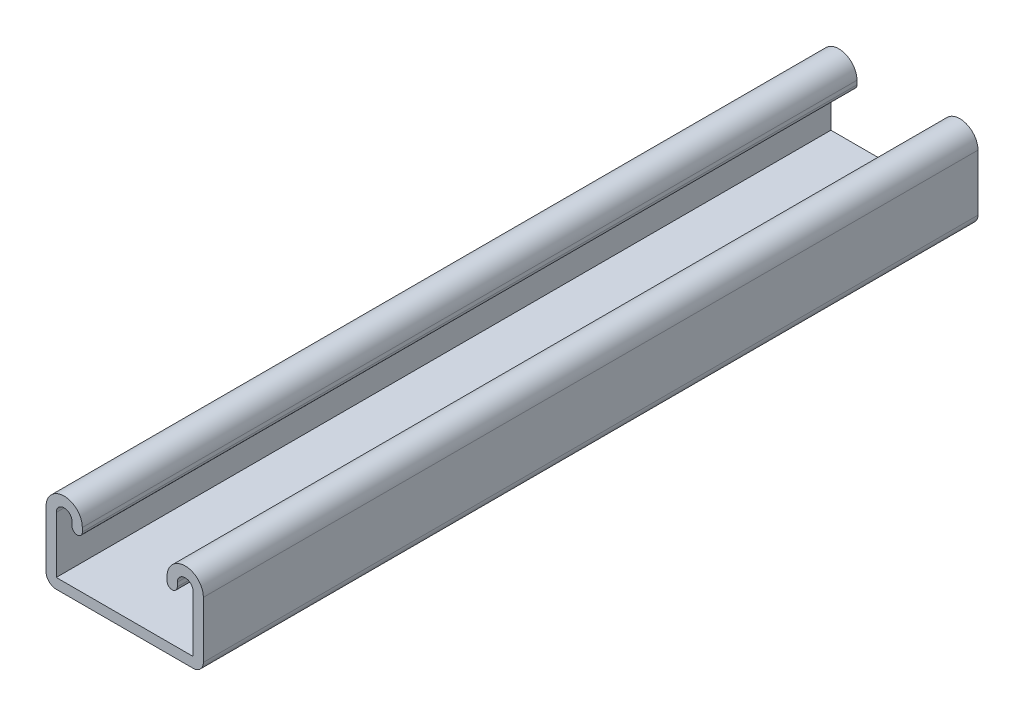
ISO-10303-21;
HEADER;
FILE_DESCRIPTION(('STEP AP214'),'2;1');
FILE_NAME('part.step','',(''),(''),'','','');
FILE_SCHEMA(('AUTOMOTIVE_DESIGN { 1 0 10303 214 1 1 1 1 }'));
ENDSEC;
DATA;
#1=APPLICATION_CONTEXT('core data for automotive mechanical design processes');
#2=APPLICATION_PROTOCOL_DEFINITION('international standard','automotive_design',2000,#1);
#3=PRODUCT_CONTEXT('',#1,'mechanical');
#4=PRODUCT('Part','Part','',(#3));
#5=PRODUCT_RELATED_PRODUCT_CATEGORY('part','',(#4));
#6=PRODUCT_DEFINITION_FORMATION('','',#4);
#7=PRODUCT_DEFINITION_CONTEXT('part definition',#1,'design');
#8=PRODUCT_DEFINITION('design','',#6,#7);
#9=PRODUCT_DEFINITION_SHAPE('','',#8);
#10=(LENGTH_UNIT() NAMED_UNIT(*) SI_UNIT(.MILLI.,.METRE.));
#11=(NAMED_UNIT(*) PLANE_ANGLE_UNIT() SI_UNIT($,.RADIAN.));
#12=(NAMED_UNIT(*) SI_UNIT($,.STERADIAN.) SOLID_ANGLE_UNIT());
#13=UNCERTAINTY_MEASURE_WITH_UNIT(LENGTH_MEASURE(1.E-05),#10,'distance_accuracy_value','');
#14=(GEOMETRIC_REPRESENTATION_CONTEXT(3) GLOBAL_UNCERTAINTY_ASSIGNED_CONTEXT((#13)) GLOBAL_UNIT_ASSIGNED_CONTEXT((#10,
#11,#12)) REPRESENTATION_CONTEXT('',''));
#15=CARTESIAN_POINT('',(0.,0.,0.));
#16=DIRECTION('',(0.,0.,1.));
#17=DIRECTION('',(1.,0.,0.));
#18=AXIS2_PLACEMENT_3D('',#15,#16,#17);
#19=CARTESIAN_POINT('',(-15.875,8.3693,203.2));
#20=DIRECTION('',(0.,0.,-1.));
#21=DIRECTION('',(-1.,0.,0.));
#22=AXIS2_PLACEMENT_3D('',#19,#20,#21);
#23=CYLINDRICAL_SURFACE('',#22,4.7625);
#24=CARTESIAN_POINT('',(-15.875,8.3693,0.));
#25=DIRECTION('',(0.,0.,1.));
#26=DIRECTION('',(-1.,0.,0.));
#27=AXIS2_PLACEMENT_3D('',#24,#25,#26);
#28=CIRCLE('',#27,4.7625);
#29=CARTESIAN_POINT('',(-11.1125,8.3693,0.));
#30=VERTEX_POINT('',#29);
#31=CARTESIAN_POINT('',(-20.6375,8.3693,0.));
#32=VERTEX_POINT('',#31);
#33=EDGE_CURVE('E253',#30,#32,#28,.T.);
#34=ORIENTED_EDGE('',*,*,#33,.T.);
#35=DIRECTION('',(0.,0.,-1.));
#36=VECTOR('',#35,1.);
#37=CARTESIAN_POINT('',(-20.6375,8.3693,203.2));
#38=LINE('',#37,#36);
#39=CARTESIAN_POINT('',(-20.6375,8.3693,203.2));
#40=VERTEX_POINT('',#39);
#41=EDGE_CURVE('E384',#40,#32,#38,.T.);
#42=ORIENTED_EDGE('',*,*,#41,.F.);
#43=CARTESIAN_POINT('',(-15.875,8.3693,203.2));
#44=DIRECTION('',(0.,0.,1.));
#45=DIRECTION('',(-1.,0.,0.));
#46=AXIS2_PLACEMENT_3D('',#43,#44,#45);
#47=CIRCLE('',#46,4.7625);
#48=CARTESIAN_POINT('',(-11.1125,8.3693,203.2));
#49=VERTEX_POINT('',#48);
#50=EDGE_CURVE('E260',#49,#40,#47,.T.);
#51=ORIENTED_EDGE('',*,*,#50,.F.);
#52=DIRECTION('',(0.,0.,-1.));
#53=VECTOR('',#52,1.);
#54=CARTESIAN_POINT('',(-11.1125,8.3693,203.2));
#55=LINE('',#54,#53);
#56=EDGE_CURVE('E298',#49,#30,#55,.T.);
#57=ORIENTED_EDGE('',*,*,#56,.T.);
#58=EDGE_LOOP('',(#34,#42,#51,#57));
#59=FACE_BOUND('',#58,.T.);
#60=ADVANCED_FACE('F32',(#59),#23,.T.);
#61=CARTESIAN_POINT('',(-20.6375,8.3693,203.2));
#62=DIRECTION('',(1.,0.,0.));
#63=DIRECTION('',(0.,1.,0.));
#64=AXIS2_PLACEMENT_3D('',#61,#62,#63);
#65=PLANE('',#64);
#66=DIRECTION('',(0.,-1.,0.));
#67=VECTOR('',#66,1.);
#68=CARTESIAN_POINT('',(-20.6375,8.3693,0.));
#69=LINE('',#68,#67);
#70=CARTESIAN_POINT('',(-20.6375,-6.4008,0.));
#71=VERTEX_POINT('',#70);
#72=EDGE_CURVE('E301',#32,#71,#69,.T.);
#73=ORIENTED_EDGE('',*,*,#72,.T.);
#74=DIRECTION('',(0.,0.,-1.));
#75=VECTOR('',#74,1.);
#76=CARTESIAN_POINT('',(-20.6375,-6.4008,203.2));
#77=LINE('',#76,#75);
#78=CARTESIAN_POINT('',(-20.6375,-6.4008,203.2));
#79=VERTEX_POINT('',#78);
#80=EDGE_CURVE('E381',#79,#71,#77,.T.);
#81=ORIENTED_EDGE('',*,*,#80,.F.);
#82=DIRECTION('',(0.,-1.,0.));
#83=VECTOR('',#82,1.);
#84=CARTESIAN_POINT('',(-20.6375,8.3693,203.2));
#85=LINE('',#84,#83);
#86=EDGE_CURVE('E263',#40,#79,#85,.T.);
#87=ORIENTED_EDGE('',*,*,#86,.F.);
#88=ORIENTED_EDGE('',*,*,#41,.T.);
#89=EDGE_LOOP('',(#73,#81,#87,#88));
#90=FACE_BOUND('',#89,.T.);
#91=ADVANCED_FACE('F425',(#90),#65,.F.);
#92=CARTESIAN_POINT('',(-17.9451,-6.4008,203.2));
#93=DIRECTION('',(0.,0.,-1.));
#94=DIRECTION('',(-1.,0.,0.));
#95=AXIS2_PLACEMENT_3D('',#92,#93,#94);
#96=CYLINDRICAL_SURFACE('',#95,2.6924);
#97=CARTESIAN_POINT('',(-17.9451,-6.4008,0.));
#98=DIRECTION('',(0.,0.,1.));
#99=DIRECTION('',(-1.,0.,0.));
#100=AXIS2_PLACEMENT_3D('',#97,#98,#99);
#101=CIRCLE('',#100,2.6924);
#102=CARTESIAN_POINT('',(-17.9451,-9.0932,0.));
#103=VERTEX_POINT('',#102);
#104=EDGE_CURVE('E303',#71,#103,#101,.T.);
#105=ORIENTED_EDGE('',*,*,#104,.T.);
#106=DIRECTION('',(0.,0.,-1.));
#107=VECTOR('',#106,1.);
#108=CARTESIAN_POINT('',(-17.9451,-9.0932,203.2));
#109=LINE('',#108,#107);
#110=CARTESIAN_POINT('',(-17.9451,-9.0932,203.2));
#111=VERTEX_POINT('',#110);
#112=EDGE_CURVE('E378',#111,#103,#109,.T.);
#113=ORIENTED_EDGE('',*,*,#112,.F.);
#114=CARTESIAN_POINT('',(-17.9451,-6.4008,203.2));
#115=DIRECTION('',(0.,0.,1.));
#116=DIRECTION('',(-1.,0.,0.));
#117=AXIS2_PLACEMENT_3D('',#114,#115,#116);
#118=CIRCLE('',#117,2.6924);
#119=EDGE_CURVE('E266',#79,#111,#118,.T.);
#120=ORIENTED_EDGE('',*,*,#119,.F.);
#121=ORIENTED_EDGE('',*,*,#80,.T.);
#122=EDGE_LOOP('',(#105,#113,#120,#121));
#123=FACE_BOUND('',#122,.T.);
#124=ADVANCED_FACE('F430',(#123),#96,.T.);
#125=CARTESIAN_POINT('',(-17.9451,-9.0932,203.2));
#126=DIRECTION('',(0.,1.,0.));
#127=DIRECTION('',(0.,0.,1.));
#128=AXIS2_PLACEMENT_3D('',#125,#126,#127);
#129=PLANE('',#128);
#130=DIRECTION('',(0.,0.,-1.));
#131=VECTOR('',#130,1.);
#132=CARTESIAN_POINT('',(-5.159375,-9.09319999999525,114.3));
#133=LINE('',#132,#131);
#134=CARTESIAN_POINT('',(-5.15937500000001,-9.0932,180.18125));
#135=VERTEX_POINT('',#134);
#136=CARTESIAN_POINT('',(-5.159375,-9.09319999999525,114.3));
#137=VERTEX_POINT('',#136);
#138=EDGE_CURVE('E206',#135,#137,#133,.T.);
#139=ORIENTED_EDGE('',*,*,#138,.F.);
#140=CARTESIAN_POINT('',(0.,-9.09319999999525,180.18125));
#141=DIRECTION('',(0.,-1.,0.));
#142=DIRECTION('',(0.,0.,-1.));
#143=AXIS2_PLACEMENT_3D('',#140,#141,#142);
#144=CIRCLE('',#143,5.159375);
#145=CARTESIAN_POINT('',(5.159375,-9.09319999999525,180.18125));
#146=VERTEX_POINT('',#145);
#147=EDGE_CURVE('E46',#146,#135,#144,.T.);
#148=ORIENTED_EDGE('',*,*,#147,.F.);
#149=DIRECTION('',(0.,0.,1.));
#150=VECTOR('',#149,1.);
#151=CARTESIAN_POINT('',(5.159375,-9.09319999999525,180.18125));
#152=LINE('',#151,#150);
#153=CARTESIAN_POINT('',(5.159375,-9.09319999999525,114.3));
#154=VERTEX_POINT('',#153);
#155=EDGE_CURVE('E222',#154,#146,#152,.T.);
#156=ORIENTED_EDGE('',*,*,#155,.F.);
#157=CARTESIAN_POINT('',(0.,-9.09319999999525,114.3));
#158=DIRECTION('',(0.,-1.,0.));
#159=DIRECTION('',(0.,0.,-1.));
#160=AXIS2_PLACEMENT_3D('',#157,#158,#159);
#161=CIRCLE('',#160,5.159375);
#162=EDGE_CURVE('E216',#137,#154,#161,.T.);
#163=ORIENTED_EDGE('',*,*,#162,.F.);
#164=EDGE_LOOP('',(#139,#148,#156,#163));
#165=FACE_BOUND('',#164,.T.);
#166=DIRECTION('',(0.,0.,-1.));
#167=VECTOR('',#166,1.);
#168=CARTESIAN_POINT('',(-5.159375,-9.09319999999525,12.7));
#169=LINE('',#168,#167);
#170=CARTESIAN_POINT('',(-5.15937500000001,-9.0932,78.58125));
#171=VERTEX_POINT('',#170);
#172=CARTESIAN_POINT('',(-5.159375,-9.09319999999525,12.7));
#173=VERTEX_POINT('',#172);
#174=EDGE_CURVE('E241',#171,#173,#169,.T.);
#175=ORIENTED_EDGE('',*,*,#174,.F.);
#176=CARTESIAN_POINT('',(0.,-9.09319999999525,78.58125));
#177=DIRECTION('',(0.,-1.,0.));
#178=DIRECTION('',(0.,0.,-1.));
#179=AXIS2_PLACEMENT_3D('',#176,#177,#178);
#180=CIRCLE('',#179,5.159375);
#181=CARTESIAN_POINT('',(5.159375,-9.09319999999525,78.58125));
#182=VERTEX_POINT('',#181);
#183=EDGE_CURVE('E239',#182,#171,#180,.T.);
#184=ORIENTED_EDGE('',*,*,#183,.F.);
#185=DIRECTION('',(0.,0.,1.));
#186=VECTOR('',#185,1.);
#187=CARTESIAN_POINT('',(5.159375,-9.09319999999525,78.58125));
#188=LINE('',#187,#186);
#189=CARTESIAN_POINT('',(5.159375,-9.09319999999525,12.7));
#190=VERTEX_POINT('',#189);
#191=EDGE_CURVE('E247',#190,#182,#188,.T.);
#192=ORIENTED_EDGE('',*,*,#191,.F.);
#193=CARTESIAN_POINT('',(0.,-9.09319999999525,12.7));
#194=DIRECTION('',(0.,-1.,0.));
#195=DIRECTION('',(0.,0.,-1.));
#196=AXIS2_PLACEMENT_3D('',#193,#194,#195);
#197=CIRCLE('',#196,5.159375);
#198=EDGE_CURVE('E244',#173,#190,#197,.T.);
#199=ORIENTED_EDGE('',*,*,#198,.F.);
#200=EDGE_LOOP('',(#175,#184,#192,#199));
#201=FACE_BOUND('',#200,.T.);
#202=DIRECTION('',(1.,0.,0.));
#203=VECTOR('',#202,1.);
#204=CARTESIAN_POINT('',(-17.9451,-9.0932,0.));
#205=LINE('',#204,#203);
#206=CARTESIAN_POINT('',(17.9451,-9.0932,0.));
#207=VERTEX_POINT('',#206);
#208=EDGE_CURVE('E305',#103,#207,#205,.T.);
#209=ORIENTED_EDGE('',*,*,#208,.T.);
#210=DIRECTION('',(0.,0.,-1.));
#211=VECTOR('',#210,1.);
#212=CARTESIAN_POINT('',(17.9451,-9.0932,203.2));
#213=LINE('',#212,#211);
#214=CARTESIAN_POINT('',(17.9451,-9.0932,203.2));
#215=VERTEX_POINT('',#214);
#216=EDGE_CURVE('E375',#215,#207,#213,.T.);
#217=ORIENTED_EDGE('',*,*,#216,.F.);
#218=DIRECTION('',(1.,0.,0.));
#219=VECTOR('',#218,1.);
#220=CARTESIAN_POINT('',(-17.9451,-9.0932,203.2));
#221=LINE('',#220,#219);
#222=EDGE_CURVE('E268',#111,#215,#221,.T.);
#223=ORIENTED_EDGE('',*,*,#222,.F.);
#224=ORIENTED_EDGE('',*,*,#112,.T.);
#225=EDGE_LOOP('',(#209,#217,#223,#224));
#226=FACE_BOUND('',#225,.T.);
#227=ADVANCED_FACE('F220',(#165,#201,#226),#129,.F.);
#228=CARTESIAN_POINT('',(17.9451,-6.4008,203.2));
#229=DIRECTION('',(0.,0.,-1.));
#230=DIRECTION('',(-1.,0.,0.));
#231=AXIS2_PLACEMENT_3D('',#228,#229,#230);
#232=CYLINDRICAL_SURFACE('',#231,2.6924);
#233=CARTESIAN_POINT('',(17.9451,-6.4008,0.));
#234=DIRECTION('',(0.,0.,1.));
#235=DIRECTION('',(1.,0.,0.));
#236=AXIS2_PLACEMENT_3D('',#233,#234,#235);
#237=CIRCLE('',#236,2.6924);
#238=CARTESIAN_POINT('',(20.6375,-6.4008,0.));
#239=VERTEX_POINT('',#238);
#240=EDGE_CURVE('E307',#207,#239,#237,.T.);
#241=ORIENTED_EDGE('',*,*,#240,.T.);
#242=DIRECTION('',(0.,0.,-1.));
#243=VECTOR('',#242,1.);
#244=CARTESIAN_POINT('',(20.6375,-6.4008,203.2));
#245=LINE('',#244,#243);
#246=CARTESIAN_POINT('',(20.6375,-6.4008,203.2));
#247=VERTEX_POINT('',#246);
#248=EDGE_CURVE('E372',#247,#239,#245,.T.);
#249=ORIENTED_EDGE('',*,*,#248,.F.);
#250=CARTESIAN_POINT('',(17.9451,-6.4008,203.2));
#251=DIRECTION('',(0.,0.,1.));
#252=DIRECTION('',(1.,0.,0.));
#253=AXIS2_PLACEMENT_3D('',#250,#251,#252);
#254=CIRCLE('',#253,2.6924);
#255=EDGE_CURVE('E270',#215,#247,#254,.T.);
#256=ORIENTED_EDGE('',*,*,#255,.F.);
#257=ORIENTED_EDGE('',*,*,#216,.T.);
#258=EDGE_LOOP('',(#241,#249,#256,#257));
#259=FACE_BOUND('',#258,.T.);
#260=ADVANCED_FACE('F510',(#259),#232,.T.);
#261=CARTESIAN_POINT('',(20.6375,-6.4008,203.2));
#262=DIRECTION('',(-1.,0.,0.));
#263=DIRECTION('',(0.,-1.,0.));
#264=AXIS2_PLACEMENT_3D('',#261,#262,#263);
#265=PLANE('',#264);
#266=DIRECTION('',(0.,1.,0.));
#267=VECTOR('',#266,1.);
#268=CARTESIAN_POINT('',(20.6375,-6.4008,0.));
#269=LINE('',#268,#267);
#270=CARTESIAN_POINT('',(20.6375,8.3693,0.));
#271=VERTEX_POINT('',#270);
#272=EDGE_CURVE('E309',#239,#271,#269,.T.);
#273=ORIENTED_EDGE('',*,*,#272,.T.);
#274=DIRECTION('',(0.,0.,-1.));
#275=VECTOR('',#274,1.);
#276=CARTESIAN_POINT('',(20.6375,8.3693,203.2));
#277=LINE('',#276,#275);
#278=CARTESIAN_POINT('',(20.6375,8.3693,203.2));
#279=VERTEX_POINT('',#278);
#280=EDGE_CURVE('E369',#279,#271,#277,.T.);
#281=ORIENTED_EDGE('',*,*,#280,.F.);
#282=DIRECTION('',(0.,1.,0.));
#283=VECTOR('',#282,1.);
#284=CARTESIAN_POINT('',(20.6375,-6.4008,203.2));
#285=LINE('',#284,#283);
#286=EDGE_CURVE('E272',#247,#279,#285,.T.);
#287=ORIENTED_EDGE('',*,*,#286,.F.);
#288=ORIENTED_EDGE('',*,*,#248,.T.);
#289=EDGE_LOOP('',(#273,#281,#287,#288));
#290=FACE_BOUND('',#289,.T.);
#291=ADVANCED_FACE('F506',(#290),#265,.F.);
#292=CARTESIAN_POINT('',(15.875,8.3693,203.2));
#293=DIRECTION('',(0.,0.,-1.));
#294=DIRECTION('',(-1.,0.,0.));
#295=AXIS2_PLACEMENT_3D('',#292,#293,#294);
#296=CYLINDRICAL_SURFACE('',#295,4.7625);
#297=CARTESIAN_POINT('',(15.875,8.3693,0.));
#298=DIRECTION('',(0.,0.,1.));
#299=DIRECTION('',(1.,0.,0.));
#300=AXIS2_PLACEMENT_3D('',#297,#298,#299);
#301=CIRCLE('',#300,4.7625);
#302=CARTESIAN_POINT('',(11.1125,8.3693,0.));
#303=VERTEX_POINT('',#302);
#304=EDGE_CURVE('E311',#271,#303,#301,.T.);
#305=ORIENTED_EDGE('',*,*,#304,.T.);
#306=DIRECTION('',(0.,0.,-1.));
#307=VECTOR('',#306,1.);
#308=CARTESIAN_POINT('',(11.1125,8.3693,203.2));
#309=LINE('',#308,#307);
#310=CARTESIAN_POINT('',(11.1125,8.3693,203.2));
#311=VERTEX_POINT('',#310);
#312=EDGE_CURVE('E366',#311,#303,#309,.T.);
#313=ORIENTED_EDGE('',*,*,#312,.F.);
#314=CARTESIAN_POINT('',(15.875,8.3693,203.2));
#315=DIRECTION('',(0.,0.,1.));
#316=DIRECTION('',(1.,0.,0.));
#317=AXIS2_PLACEMENT_3D('',#314,#315,#316);
#318=CIRCLE('',#317,4.7625);
#319=EDGE_CURVE('E274',#279,#311,#318,.T.);
#320=ORIENTED_EDGE('',*,*,#319,.F.);
#321=ORIENTED_EDGE('',*,*,#280,.T.);
#322=EDGE_LOOP('',(#305,#313,#320,#321));
#323=FACE_BOUND('',#322,.T.);
#324=ADVANCED_FACE('F501',(#323),#296,.T.);
#325=CARTESIAN_POINT('',(11.1125,8.3693,203.2));
#326=DIRECTION('',(1.,0.,0.));
#327=DIRECTION('',(0.,0.,-1.));
#328=AXIS2_PLACEMENT_3D('',#325,#326,#327);
#329=PLANE('',#328);
#330=DIRECTION('',(0.,-1.,0.));
#331=VECTOR('',#330,1.);
#332=CARTESIAN_POINT('',(11.1125,8.3693,0.));
#333=LINE('',#332,#331);
#334=CARTESIAN_POINT('',(11.1125,7.33425,0.));
#335=VERTEX_POINT('',#334);
#336=EDGE_CURVE('E313',#303,#335,#333,.T.);
#337=ORIENTED_EDGE('',*,*,#336,.T.);
#338=DIRECTION('',(0.,0.,-1.));
#339=VECTOR('',#338,1.);
#340=CARTESIAN_POINT('',(11.1125,7.33425,203.2));
#341=LINE('',#340,#339);
#342=CARTESIAN_POINT('',(11.1125,7.33425,203.2));
#343=VERTEX_POINT('',#342);
#344=EDGE_CURVE('E363',#343,#335,#341,.T.);
#345=ORIENTED_EDGE('',*,*,#344,.F.);
#346=DIRECTION('',(0.,-1.,0.));
#347=VECTOR('',#346,1.);
#348=CARTESIAN_POINT('',(11.1125,8.3693,203.2));
#349=LINE('',#348,#347);
#350=EDGE_CURVE('E276',#311,#343,#349,.T.);
#351=ORIENTED_EDGE('',*,*,#350,.F.);
#352=ORIENTED_EDGE('',*,*,#312,.T.);
#353=EDGE_LOOP('',(#337,#345,#351,#352));
#354=FACE_BOUND('',#353,.T.);
#355=ADVANCED_FACE('F495',(#354),#329,.F.);
#356=CARTESIAN_POINT('',(12.4587,7.33425,203.2));
#357=DIRECTION('',(0.,0.,-1.));
#358=DIRECTION('',(-1.,0.,0.));
#359=AXIS2_PLACEMENT_3D('',#356,#357,#358);
#360=CYLINDRICAL_SURFACE('',#359,1.3462);
#361=CARTESIAN_POINT('',(12.4587,7.33425,0.));
#362=DIRECTION('',(0.,0.,1.));
#363=DIRECTION('',(1.,0.,0.));
#364=AXIS2_PLACEMENT_3D('',#361,#362,#363);
#365=CIRCLE('',#364,1.3462);
#366=CARTESIAN_POINT('',(13.8049,7.33425,0.));
#367=VERTEX_POINT('',#366);
#368=EDGE_CURVE('E315',#335,#367,#365,.T.);
#369=ORIENTED_EDGE('',*,*,#368,.T.);
#370=DIRECTION('',(0.,0.,-1.));
#371=VECTOR('',#370,1.);
#372=CARTESIAN_POINT('',(13.8049,7.33425,203.2));
#373=LINE('',#372,#371);
#374=CARTESIAN_POINT('',(13.8049,7.33425,203.2));
#375=VERTEX_POINT('',#374);
#376=EDGE_CURVE('E360',#375,#367,#373,.T.);
#377=ORIENTED_EDGE('',*,*,#376,.F.);
#378=CARTESIAN_POINT('',(12.4587,7.33425,203.2));
#379=DIRECTION('',(0.,0.,1.));
#380=DIRECTION('',(1.,0.,0.));
#381=AXIS2_PLACEMENT_3D('',#378,#379,#380);
#382=CIRCLE('',#381,1.3462);
#383=EDGE_CURVE('E278',#343,#375,#382,.T.);
#384=ORIENTED_EDGE('',*,*,#383,.F.);
#385=ORIENTED_EDGE('',*,*,#344,.T.);
#386=EDGE_LOOP('',(#369,#377,#384,#385));
#387=FACE_BOUND('',#386,.T.);
#388=ADVANCED_FACE('F491',(#387),#360,.T.);
#389=CARTESIAN_POINT('',(13.8049,8.3693,203.2));
#390=DIRECTION('',(-1.,0.,0.));
#391=DIRECTION('',(0.,0.,1.));
#392=AXIS2_PLACEMENT_3D('',#389,#390,#391);
#393=PLANE('',#392);
#394=DIRECTION('',(0.,1.,0.));
#395=VECTOR('',#394,1.);
#396=CARTESIAN_POINT('',(13.8049,8.3693,0.));
#397=LINE('',#396,#395);
#398=CARTESIAN_POINT('',(13.8049,8.3693,0.));
#399=VERTEX_POINT('',#398);
#400=EDGE_CURVE('E317',#367,#399,#397,.T.);
#401=ORIENTED_EDGE('',*,*,#400,.T.);
#402=DIRECTION('',(0.,0.,-1.));
#403=VECTOR('',#402,1.);
#404=CARTESIAN_POINT('',(13.8049,8.3693,203.2));
#405=LINE('',#404,#403);
#406=CARTESIAN_POINT('',(13.8049,8.3693,203.2));
#407=VERTEX_POINT('',#406);
#408=EDGE_CURVE('E357',#407,#399,#405,.T.);
#409=ORIENTED_EDGE('',*,*,#408,.F.);
#410=DIRECTION('',(0.,1.,0.));
#411=VECTOR('',#410,1.);
#412=CARTESIAN_POINT('',(13.8049,8.3693,203.2));
#413=LINE('',#412,#411);
#414=EDGE_CURVE('E280',#375,#407,#413,.T.);
#415=ORIENTED_EDGE('',*,*,#414,.F.);
#416=ORIENTED_EDGE('',*,*,#376,.T.);
#417=EDGE_LOOP('',(#401,#409,#415,#416));
#418=FACE_BOUND('',#417,.T.);
#419=ADVANCED_FACE('F486',(#418),#393,.F.);
#420=CARTESIAN_POINT('',(15.875,8.3693,203.2));
#421=DIRECTION('',(0.,0.,-1.));
#422=DIRECTION('',(-1.,0.,0.));
#423=AXIS2_PLACEMENT_3D('',#420,#421,#422);
#424=CYLINDRICAL_SURFACE('',#423,2.0701);
#425=CARTESIAN_POINT('',(15.875,8.3693,0.));
#426=DIRECTION('',(0.,0.,-1.));
#427=DIRECTION('',(1.,0.,0.));
#428=AXIS2_PLACEMENT_3D('',#425,#426,#427);
#429=CIRCLE('',#428,2.0701);
#430=CARTESIAN_POINT('',(17.9451,8.3693,0.));
#431=VERTEX_POINT('',#430);
#432=EDGE_CURVE('E319',#399,#431,#429,.T.);
#433=ORIENTED_EDGE('',*,*,#432,.T.);
#434=DIRECTION('',(0.,0.,-1.));
#435=VECTOR('',#434,1.);
#436=CARTESIAN_POINT('',(17.9451,8.3693,203.2));
#437=LINE('',#436,#435);
#438=CARTESIAN_POINT('',(17.9451,8.3693,203.2));
#439=VERTEX_POINT('',#438);
#440=EDGE_CURVE('E354',#439,#431,#437,.T.);
#441=ORIENTED_EDGE('',*,*,#440,.F.);
#442=CARTESIAN_POINT('',(15.875,8.3693,203.2));
#443=DIRECTION('',(0.,0.,-1.));
#444=DIRECTION('',(1.,0.,0.));
#445=AXIS2_PLACEMENT_3D('',#442,#443,#444);
#446=CIRCLE('',#445,2.0701);
#447=EDGE_CURVE('E282',#407,#439,#446,.T.);
#448=ORIENTED_EDGE('',*,*,#447,.F.);
#449=ORIENTED_EDGE('',*,*,#408,.T.);
#450=EDGE_LOOP('',(#433,#441,#448,#449));
#451=FACE_BOUND('',#450,.T.);
#452=ADVANCED_FACE('F480',(#451),#424,.F.);
#453=CARTESIAN_POINT('',(17.9451,-6.4008,203.2));
#454=DIRECTION('',(1.,0.,0.));
#455=DIRECTION('',(0.,1.,0.));
#456=AXIS2_PLACEMENT_3D('',#453,#454,#455);
#457=PLANE('',#456);
#458=DIRECTION('',(0.,-1.,0.));
#459=VECTOR('',#458,1.);
#460=CARTESIAN_POINT('',(17.9451,-6.4008,0.));
#461=LINE('',#460,#459);
#462=CARTESIAN_POINT('',(17.9451,-6.4008,0.));
#463=VERTEX_POINT('',#462);
#464=EDGE_CURVE('E321',#431,#463,#461,.T.);
#465=ORIENTED_EDGE('',*,*,#464,.T.);
#466=DIRECTION('',(0.,0.,-1.));
#467=VECTOR('',#466,1.);
#468=CARTESIAN_POINT('',(17.9451,-6.4008,203.2));
#469=LINE('',#468,#467);
#470=CARTESIAN_POINT('',(17.9451,-6.4008,203.2));
#471=VERTEX_POINT('',#470);
#472=EDGE_CURVE('E351',#471,#463,#469,.T.);
#473=ORIENTED_EDGE('',*,*,#472,.F.);
#474=DIRECTION('',(0.,-1.,0.));
#475=VECTOR('',#474,1.);
#476=CARTESIAN_POINT('',(17.9451,-6.4008,203.2));
#477=LINE('',#476,#475);
#478=EDGE_CURVE('E284',#439,#471,#477,.T.);
#479=ORIENTED_EDGE('',*,*,#478,.F.);
#480=ORIENTED_EDGE('',*,*,#440,.T.);
#481=EDGE_LOOP('',(#465,#473,#479,#480));
#482=FACE_BOUND('',#481,.T.);
#483=ADVANCED_FACE('F476',(#482),#457,.F.);
#484=CARTESIAN_POINT('',(-17.9451,-6.4008,203.2));
#485=DIRECTION('',(0.,-1.,0.));
#486=DIRECTION('',(0.,0.,-1.));
#487=AXIS2_PLACEMENT_3D('',#484,#485,#486);
#488=PLANE('',#487);
#489=DIRECTION('',(0.,0.,1.));
#490=VECTOR('',#489,1.);
#491=CARTESIAN_POINT('',(5.159375,-6.4008,304.8));
#492=LINE('',#491,#490);
#493=CARTESIAN_POINT('',(5.159375,-6.4008,114.3));
#494=VERTEX_POINT('',#493);
#495=CARTESIAN_POINT('',(5.159375,-6.4008,180.18125));
#496=VERTEX_POINT('',#495);
#497=EDGE_CURVE('E232',#494,#496,#492,.T.);
#498=ORIENTED_EDGE('',*,*,#497,.T.);
#499=CARTESIAN_POINT('',(0.,-6.4008,180.18125));
#500=DIRECTION('',(0.,-1.,0.));
#501=DIRECTION('',(0.,0.,-1.));
#502=AXIS2_PLACEMENT_3D('',#499,#500,#501);
#503=CIRCLE('',#502,5.159375);
#504=CARTESIAN_POINT('',(-5.15937500000001,-6.4008,180.18125));
#505=VERTEX_POINT('',#504);
#506=EDGE_CURVE('E236',#496,#505,#503,.T.);
#507=ORIENTED_EDGE('',*,*,#506,.T.);
#508=DIRECTION('',(0.,0.,-1.));
#509=VECTOR('',#508,1.);
#510=CARTESIAN_POINT('',(-5.15937500000002,-6.4008,304.8));
#511=LINE('',#510,#509);
#512=CARTESIAN_POINT('',(-5.159375,-6.4008,114.3));
#513=VERTEX_POINT('',#512);
#514=EDGE_CURVE('E213',#505,#513,#511,.T.);
#515=ORIENTED_EDGE('',*,*,#514,.T.);
#516=CARTESIAN_POINT('',(0.,-6.4008,114.3));
#517=DIRECTION('',(0.,-1.,0.));
#518=DIRECTION('',(0.,0.,-1.));
#519=AXIS2_PLACEMENT_3D('',#516,#517,#518);
#520=CIRCLE('',#519,5.159375);
#521=EDGE_CURVE('E54',#513,#494,#520,.T.);
#522=ORIENTED_EDGE('',*,*,#521,.T.);
#523=EDGE_LOOP('',(#498,#507,#515,#522));
#524=FACE_BOUND('',#523,.T.);
#525=DIRECTION('',(0.,0.,1.));
#526=VECTOR('',#525,1.);
#527=CARTESIAN_POINT('',(5.159375,-6.4008,203.2));
#528=LINE('',#527,#526);
#529=CARTESIAN_POINT('',(5.159375,-6.4008,12.7));
#530=VERTEX_POINT('',#529);
#531=CARTESIAN_POINT('',(5.159375,-6.4008,78.58125));
#532=VERTEX_POINT('',#531);
#533=EDGE_CURVE('E39',#530,#532,#528,.T.);
#534=ORIENTED_EDGE('',*,*,#533,.T.);
#535=CARTESIAN_POINT('',(0.,-6.4008,78.58125));
#536=DIRECTION('',(0.,-1.,0.));
#537=DIRECTION('',(0.,0.,-1.));
#538=AXIS2_PLACEMENT_3D('',#535,#536,#537);
#539=CIRCLE('',#538,5.159375);
#540=CARTESIAN_POINT('',(-5.15937500000001,-6.4008,78.58125));
#541=VERTEX_POINT('',#540);
#542=EDGE_CURVE('E11',#532,#541,#539,.T.);
#543=ORIENTED_EDGE('',*,*,#542,.T.);
#544=DIRECTION('',(0.,0.,-1.));
#545=VECTOR('',#544,1.);
#546=CARTESIAN_POINT('',(-5.15937500000002,-6.4008,203.2));
#547=LINE('',#546,#545);
#548=CARTESIAN_POINT('',(-5.159375,-6.4008,12.7));
#549=VERTEX_POINT('',#548);
#550=EDGE_CURVE('E387',#541,#549,#547,.T.);
#551=ORIENTED_EDGE('',*,*,#550,.T.);
#552=CARTESIAN_POINT('',(0.,-6.4008,12.7));
#553=DIRECTION('',(0.,-1.,0.));
#554=DIRECTION('',(0.,0.,-1.));
#555=AXIS2_PLACEMENT_3D('',#552,#553,#554);
#556=CIRCLE('',#555,5.159375);
#557=EDGE_CURVE('E390',#549,#530,#556,.T.);
#558=ORIENTED_EDGE('',*,*,#557,.T.);
#559=EDGE_LOOP('',(#534,#543,#551,#558));
#560=FACE_BOUND('',#559,.T.);
#561=DIRECTION('',(-1.,0.,0.));
#562=VECTOR('',#561,1.);
#563=CARTESIAN_POINT('',(-17.9451,-6.4008,0.));
#564=LINE('',#563,#562);
#565=CARTESIAN_POINT('',(-17.9451,-6.4008,0.));
#566=VERTEX_POINT('',#565);
#567=EDGE_CURVE('E323',#463,#566,#564,.T.);
#568=ORIENTED_EDGE('',*,*,#567,.T.);
#569=DIRECTION('',(0.,0.,-1.));
#570=VECTOR('',#569,1.);
#571=CARTESIAN_POINT('',(-17.9451,-6.4008,203.2));
#572=LINE('',#571,#570);
#573=CARTESIAN_POINT('',(-17.9451,-6.4008,203.2));
#574=VERTEX_POINT('',#573);
#575=EDGE_CURVE('E348',#574,#566,#572,.T.);
#576=ORIENTED_EDGE('',*,*,#575,.F.);
#577=DIRECTION('',(-1.,0.,0.));
#578=VECTOR('',#577,1.);
#579=CARTESIAN_POINT('',(-17.9451,-6.4008,203.2));
#580=LINE('',#579,#578);
#581=EDGE_CURVE('E286',#471,#574,#580,.T.);
#582=ORIENTED_EDGE('',*,*,#581,.F.);
#583=ORIENTED_EDGE('',*,*,#472,.T.);
#584=EDGE_LOOP('',(#568,#576,#582,#583));
#585=FACE_BOUND('',#584,.T.);
#586=ADVANCED_FACE('F394',(#524,#560,#585),#488,.F.);
#587=CARTESIAN_POINT('',(-17.9451,8.3693,203.2));
#588=DIRECTION('',(-1.,0.,0.));
#589=DIRECTION('',(0.,-1.,0.));
#590=AXIS2_PLACEMENT_3D('',#587,#588,#589);
#591=PLANE('',#590);
#592=DIRECTION('',(0.,1.,0.));
#593=VECTOR('',#592,1.);
#594=CARTESIAN_POINT('',(-17.9451,8.3693,0.));
#595=LINE('',#594,#593);
#596=CARTESIAN_POINT('',(-17.9451,8.3693,0.));
#597=VERTEX_POINT('',#596);
#598=EDGE_CURVE('E325',#566,#597,#595,.T.);
#599=ORIENTED_EDGE('',*,*,#598,.T.);
#600=DIRECTION('',(0.,0.,-1.));
#601=VECTOR('',#600,1.);
#602=CARTESIAN_POINT('',(-17.9451,8.3693,203.2));
#603=LINE('',#602,#601);
#604=CARTESIAN_POINT('',(-17.9451,8.3693,203.2));
#605=VERTEX_POINT('',#604);
#606=EDGE_CURVE('E345',#605,#597,#603,.T.);
#607=ORIENTED_EDGE('',*,*,#606,.F.);
#608=DIRECTION('',(0.,1.,0.));
#609=VECTOR('',#608,1.);
#610=CARTESIAN_POINT('',(-17.9451,8.3693,203.2));
#611=LINE('',#610,#609);
#612=EDGE_CURVE('E288',#574,#605,#611,.T.);
#613=ORIENTED_EDGE('',*,*,#612,.F.);
#614=ORIENTED_EDGE('',*,*,#575,.T.);
#615=EDGE_LOOP('',(#599,#607,#613,#614));
#616=FACE_BOUND('',#615,.T.);
#617=ADVANCED_FACE('F467',(#616),#591,.F.);
#618=CARTESIAN_POINT('',(-15.875,8.3693,203.2));
#619=DIRECTION('',(0.,0.,-1.));
#620=DIRECTION('',(-1.,0.,0.));
#621=AXIS2_PLACEMENT_3D('',#618,#619,#620);
#622=CYLINDRICAL_SURFACE('',#621,2.0701);
#623=CARTESIAN_POINT('',(-15.875,8.3693,0.));
#624=DIRECTION('',(0.,0.,-1.));
#625=DIRECTION('',(-1.,0.,0.));
#626=AXIS2_PLACEMENT_3D('',#623,#624,#625);
#627=CIRCLE('',#626,2.0701);
#628=CARTESIAN_POINT('',(-13.8049,8.3693,0.));
#629=VERTEX_POINT('',#628);
#630=EDGE_CURVE('E327',#597,#629,#627,.T.);
#631=ORIENTED_EDGE('',*,*,#630,.T.);
#632=DIRECTION('',(0.,0.,-1.));
#633=VECTOR('',#632,1.);
#634=CARTESIAN_POINT('',(-13.8049,8.3693,203.2));
#635=LINE('',#634,#633);
#636=CARTESIAN_POINT('',(-13.8049,8.3693,203.2));
#637=VERTEX_POINT('',#636);
#638=EDGE_CURVE('E342',#637,#629,#635,.T.);
#639=ORIENTED_EDGE('',*,*,#638,.F.);
#640=CARTESIAN_POINT('',(-15.875,8.3693,203.2));
#641=DIRECTION('',(0.,0.,-1.));
#642=DIRECTION('',(-1.,0.,0.));
#643=AXIS2_PLACEMENT_3D('',#640,#641,#642);
#644=CIRCLE('',#643,2.0701);
#645=EDGE_CURVE('E290',#605,#637,#644,.T.);
#646=ORIENTED_EDGE('',*,*,#645,.F.);
#647=ORIENTED_EDGE('',*,*,#606,.T.);
#648=EDGE_LOOP('',(#631,#639,#646,#647));
#649=FACE_BOUND('',#648,.T.);
#650=ADVANCED_FACE('F463',(#649),#622,.F.);
#651=CARTESIAN_POINT('',(-13.8049,8.3693,203.2));
#652=DIRECTION('',(1.,0.,0.));
#653=DIRECTION('',(0.,1.,0.));
#654=AXIS2_PLACEMENT_3D('',#651,#652,#653);
#655=PLANE('',#654);
#656=DIRECTION('',(0.,-1.,0.));
#657=VECTOR('',#656,1.);
#658=CARTESIAN_POINT('',(-13.8049,8.3693,0.));
#659=LINE('',#658,#657);
#660=CARTESIAN_POINT('',(-13.8049,7.33425,0.));
#661=VERTEX_POINT('',#660);
#662=EDGE_CURVE('E329',#629,#661,#659,.T.);
#663=ORIENTED_EDGE('',*,*,#662,.T.);
#664=DIRECTION('',(0.,0.,-1.));
#665=VECTOR('',#664,1.);
#666=CARTESIAN_POINT('',(-13.8049,7.33425,203.2));
#667=LINE('',#666,#665);
#668=CARTESIAN_POINT('',(-13.8049,7.33425,203.2));
#669=VERTEX_POINT('',#668);
#670=EDGE_CURVE('E339',#669,#661,#667,.T.);
#671=ORIENTED_EDGE('',*,*,#670,.F.);
#672=DIRECTION('',(0.,-1.,0.));
#673=VECTOR('',#672,1.);
#674=CARTESIAN_POINT('',(-13.8049,8.3693,203.2));
#675=LINE('',#674,#673);
#676=EDGE_CURVE('E292',#637,#669,#675,.T.);
#677=ORIENTED_EDGE('',*,*,#676,.F.);
#678=ORIENTED_EDGE('',*,*,#638,.T.);
#679=EDGE_LOOP('',(#663,#671,#677,#678));
#680=FACE_BOUND('',#679,.T.);
#681=ADVANCED_FACE('F458',(#680),#655,.F.);
#682=CARTESIAN_POINT('',(-12.4587,7.33425,203.2));
#683=DIRECTION('',(0.,0.,-1.));
#684=DIRECTION('',(-1.,0.,0.));
#685=AXIS2_PLACEMENT_3D('',#682,#683,#684);
#686=CYLINDRICAL_SURFACE('',#685,1.3462);
#687=CARTESIAN_POINT('',(-12.4587,7.33425,0.));
#688=DIRECTION('',(0.,0.,1.));
#689=DIRECTION('',(-1.,0.,0.));
#690=AXIS2_PLACEMENT_3D('',#687,#688,#689);
#691=CIRCLE('',#690,1.3462);
#692=CARTESIAN_POINT('',(-11.1125,7.33425,0.));
#693=VERTEX_POINT('',#692);
#694=EDGE_CURVE('E331',#661,#693,#691,.T.);
#695=ORIENTED_EDGE('',*,*,#694,.T.);
#696=DIRECTION('',(0.,0.,-1.));
#697=VECTOR('',#696,1.);
#698=CARTESIAN_POINT('',(-11.1125,7.33425,203.2));
#699=LINE('',#698,#697);
#700=CARTESIAN_POINT('',(-11.1125,7.33425,203.2));
#701=VERTEX_POINT('',#700);
#702=EDGE_CURVE('E336',#701,#693,#699,.T.);
#703=ORIENTED_EDGE('',*,*,#702,.F.);
#704=CARTESIAN_POINT('',(-12.4587,7.33425,203.2));
#705=DIRECTION('',(0.,0.,1.));
#706=DIRECTION('',(-1.,0.,0.));
#707=AXIS2_PLACEMENT_3D('',#704,#705,#706);
#708=CIRCLE('',#707,1.3462);
#709=EDGE_CURVE('E294',#669,#701,#708,.T.);
#710=ORIENTED_EDGE('',*,*,#709,.F.);
#711=ORIENTED_EDGE('',*,*,#670,.T.);
#712=EDGE_LOOP('',(#695,#703,#710,#711));
#713=FACE_BOUND('',#712,.T.);
#714=ADVANCED_FACE('F452',(#713),#686,.T.);
#715=CARTESIAN_POINT('',(-11.1125,8.3693,203.2));
#716=DIRECTION('',(-1.,0.,0.));
#717=DIRECTION('',(0.,0.,1.));
#718=AXIS2_PLACEMENT_3D('',#715,#716,#717);
#719=PLANE('',#718);
#720=DIRECTION('',(0.,1.,0.));
#721=VECTOR('',#720,1.);
#722=CARTESIAN_POINT('',(-11.1125,8.3693,0.));
#723=LINE('',#722,#721);
#724=EDGE_CURVE('E264',#693,#30,#723,.T.);
#725=ORIENTED_EDGE('',*,*,#724,.T.);
#726=ORIENTED_EDGE('',*,*,#56,.F.);
#727=DIRECTION('',(0.,1.,0.));
#728=VECTOR('',#727,1.);
#729=CARTESIAN_POINT('',(-11.1125,8.3693,203.2));
#730=LINE('',#729,#728);
#731=EDGE_CURVE('E296',#701,#49,#730,.T.);
#732=ORIENTED_EDGE('',*,*,#731,.F.);
#733=ORIENTED_EDGE('',*,*,#702,.T.);
#734=EDGE_LOOP('',(#725,#726,#732,#733));
#735=FACE_BOUND('',#734,.T.);
#736=ADVANCED_FACE('F450',(#735),#719,.F.);
#737=CARTESIAN_POINT('',(-15.875,8.3693,203.2));
#738=DIRECTION('',(0.,0.,-1.));
#739=DIRECTION('',(-1.,0.,0.));
#740=AXIS2_PLACEMENT_3D('',#737,#738,#739);
#741=PLANE('',#740);
#742=ORIENTED_EDGE('',*,*,#50,.T.);
#743=ORIENTED_EDGE('',*,*,#86,.T.);
#744=ORIENTED_EDGE('',*,*,#119,.T.);
#745=ORIENTED_EDGE('',*,*,#222,.T.);
#746=ORIENTED_EDGE('',*,*,#255,.T.);
#747=ORIENTED_EDGE('',*,*,#286,.T.);
#748=ORIENTED_EDGE('',*,*,#319,.T.);
#749=ORIENTED_EDGE('',*,*,#350,.T.);
#750=ORIENTED_EDGE('',*,*,#383,.T.);
#751=ORIENTED_EDGE('',*,*,#414,.T.);
#752=ORIENTED_EDGE('',*,*,#447,.T.);
#753=ORIENTED_EDGE('',*,*,#478,.T.);
#754=ORIENTED_EDGE('',*,*,#581,.T.);
#755=ORIENTED_EDGE('',*,*,#612,.T.);
#756=ORIENTED_EDGE('',*,*,#645,.T.);
#757=ORIENTED_EDGE('',*,*,#676,.T.);
#758=ORIENTED_EDGE('',*,*,#709,.T.);
#759=ORIENTED_EDGE('',*,*,#731,.T.);
#760=EDGE_LOOP('',(#742,#743,#744,#745,#746,#747,#748,#749,#750,#751,#752,#753,#754,#755,#756,
#757,#758,#759));
#761=FACE_BOUND('',#760,.T.);
#762=ADVANCED_FACE('F445',(#761),#741,.F.);
#763=CARTESIAN_POINT('',(-15.875,8.3693,0.));
#764=DIRECTION('',(0.,0.,-1.));
#765=DIRECTION('',(-1.,0.,0.));
#766=AXIS2_PLACEMENT_3D('',#763,#764,#765);
#767=PLANE('',#766);
#768=ORIENTED_EDGE('',*,*,#33,.F.);
#769=ORIENTED_EDGE('',*,*,#724,.F.);
#770=ORIENTED_EDGE('',*,*,#694,.F.);
#771=ORIENTED_EDGE('',*,*,#662,.F.);
#772=ORIENTED_EDGE('',*,*,#630,.F.);
#773=ORIENTED_EDGE('',*,*,#598,.F.);
#774=ORIENTED_EDGE('',*,*,#567,.F.);
#775=ORIENTED_EDGE('',*,*,#464,.F.);
#776=ORIENTED_EDGE('',*,*,#432,.F.);
#777=ORIENTED_EDGE('',*,*,#400,.F.);
#778=ORIENTED_EDGE('',*,*,#368,.F.);
#779=ORIENTED_EDGE('',*,*,#336,.F.);
#780=ORIENTED_EDGE('',*,*,#304,.F.);
#781=ORIENTED_EDGE('',*,*,#272,.F.);
#782=ORIENTED_EDGE('',*,*,#240,.F.);
#783=ORIENTED_EDGE('',*,*,#208,.F.);
#784=ORIENTED_EDGE('',*,*,#104,.F.);
#785=ORIENTED_EDGE('',*,*,#72,.F.);
#786=EDGE_LOOP('',(#768,#769,#770,#771,#772,#773,#774,#775,#776,#777,#778,#779,#780,#781,#782,
#783,#784,#785));
#787=FACE_BOUND('',#786,.T.);
#788=ADVANCED_FACE('F438',(#787),#767,.T.);
#789=CARTESIAN_POINT('',(0.,13.1318,78.58125));
#790=DIRECTION('',(0.,-1.,0.));
#791=DIRECTION('',(0.,0.,-1.));
#792=AXIS2_PLACEMENT_3D('',#789,#790,#791);
#793=CYLINDRICAL_SURFACE('',#792,5.159375);
#794=DIRECTION('',(0.,-1.,0.));
#795=VECTOR('',#794,1.);
#796=CARTESIAN_POINT('',(5.159375,13.1318,78.58125));
#797=LINE('',#796,#795);
#798=EDGE_CURVE('E251',#532,#182,#797,.T.);
#799=ORIENTED_EDGE('',*,*,#798,.T.);
#800=ORIENTED_EDGE('',*,*,#183,.T.);
#801=DIRECTION('',(0.,-1.,0.));
#802=VECTOR('',#801,1.);
#803=CARTESIAN_POINT('',(-5.15937500000001,13.1318,78.58125));
#804=LINE('',#803,#802);
#805=EDGE_CURVE('E250',#541,#171,#804,.T.);
#806=ORIENTED_EDGE('',*,*,#805,.F.);
#807=ORIENTED_EDGE('',*,*,#542,.F.);
#808=EDGE_LOOP('',(#799,#800,#806,#807));
#809=FACE_BOUND('',#808,.T.);
#810=ADVANCED_FACE('F410',(#809),#793,.F.);
#811=CARTESIAN_POINT('',(5.159375,13.1318,78.58125));
#812=DIRECTION('',(1.,0.,0.));
#813=DIRECTION('',(0.,0.,-1.));
#814=AXIS2_PLACEMENT_3D('',#811,#812,#813);
#815=PLANE('',#814);
#816=DIRECTION('',(0.,-1.,0.));
#817=VECTOR('',#816,1.);
#818=CARTESIAN_POINT('',(5.159375,13.1318,12.7));
#819=LINE('',#818,#817);
#820=EDGE_CURVE('E254',#530,#190,#819,.T.);
#821=ORIENTED_EDGE('',*,*,#820,.T.);
#822=ORIENTED_EDGE('',*,*,#191,.T.);
#823=ORIENTED_EDGE('',*,*,#798,.F.);
#824=ORIENTED_EDGE('',*,*,#533,.F.);
#825=EDGE_LOOP('',(#821,#822,#823,#824));
#826=FACE_BOUND('',#825,.T.);
#827=ADVANCED_FACE('F400',(#826),#815,.F.);
#828=CARTESIAN_POINT('',(0.,13.1318,12.7));
#829=DIRECTION('',(0.,-1.,0.));
#830=DIRECTION('',(0.,0.,-1.));
#831=AXIS2_PLACEMENT_3D('',#828,#829,#830);
#832=CYLINDRICAL_SURFACE('',#831,5.159375);
#833=DIRECTION('',(0.,-1.,0.));
#834=VECTOR('',#833,1.);
#835=CARTESIAN_POINT('',(-5.159375,13.1318,12.7));
#836=LINE('',#835,#834);
#837=EDGE_CURVE('E256',#549,#173,#836,.T.);
#838=ORIENTED_EDGE('',*,*,#837,.T.);
#839=ORIENTED_EDGE('',*,*,#198,.T.);
#840=ORIENTED_EDGE('',*,*,#820,.F.);
#841=ORIENTED_EDGE('',*,*,#557,.F.);
#842=EDGE_LOOP('',(#838,#839,#840,#841));
#843=FACE_BOUND('',#842,.T.);
#844=ADVANCED_FACE('F402',(#843),#832,.F.);
#845=CARTESIAN_POINT('',(-5.159375,13.1318,12.7));
#846=DIRECTION('',(-1.,0.,0.));
#847=DIRECTION('',(0.,0.,1.));
#848=AXIS2_PLACEMENT_3D('',#845,#846,#847);
#849=PLANE('',#848);
#850=ORIENTED_EDGE('',*,*,#805,.T.);
#851=ORIENTED_EDGE('',*,*,#174,.T.);
#852=ORIENTED_EDGE('',*,*,#837,.F.);
#853=ORIENTED_EDGE('',*,*,#550,.F.);
#854=EDGE_LOOP('',(#850,#851,#852,#853));
#855=FACE_BOUND('',#854,.T.);
#856=ADVANCED_FACE('F412',(#855),#849,.F.);
#857=CARTESIAN_POINT('',(0.,13.1318,180.18125));
#858=DIRECTION('',(0.,-1.,0.));
#859=DIRECTION('',(0.,0.,-1.));
#860=AXIS2_PLACEMENT_3D('',#857,#858,#859);
#861=CYLINDRICAL_SURFACE('',#860,5.159375);
#862=DIRECTION('',(0.,-1.,0.));
#863=VECTOR('',#862,1.);
#864=CARTESIAN_POINT('',(5.159375,13.1318,180.18125));
#865=LINE('',#864,#863);
#866=EDGE_CURVE('E230',#496,#146,#865,.T.);
#867=ORIENTED_EDGE('',*,*,#866,.T.);
#868=ORIENTED_EDGE('',*,*,#147,.T.);
#869=DIRECTION('',(0.,-1.,0.));
#870=VECTOR('',#869,1.);
#871=CARTESIAN_POINT('',(-5.15937500000001,13.1318,180.18125));
#872=LINE('',#871,#870);
#873=EDGE_CURVE('E210',#505,#135,#872,.T.);
#874=ORIENTED_EDGE('',*,*,#873,.F.);
#875=ORIENTED_EDGE('',*,*,#506,.F.);
#876=EDGE_LOOP('',(#867,#868,#874,#875));
#877=FACE_BOUND('',#876,.T.);
#878=ADVANCED_FACE('F414',(#877),#861,.F.);
#879=CARTESIAN_POINT('',(5.159375,13.1318,180.18125));
#880=DIRECTION('',(1.,0.,0.));
#881=DIRECTION('',(0.,0.,-1.));
#882=AXIS2_PLACEMENT_3D('',#879,#880,#881);
#883=PLANE('',#882);
#884=DIRECTION('',(0.,-1.,0.));
#885=VECTOR('',#884,1.);
#886=CARTESIAN_POINT('',(5.159375,13.1318,114.3));
#887=LINE('',#886,#885);
#888=EDGE_CURVE('E223',#494,#154,#887,.T.);
#889=ORIENTED_EDGE('',*,*,#888,.T.);
#890=ORIENTED_EDGE('',*,*,#155,.T.);
#891=ORIENTED_EDGE('',*,*,#866,.F.);
#892=ORIENTED_EDGE('',*,*,#497,.F.);
#893=EDGE_LOOP('',(#889,#890,#891,#892));
#894=FACE_BOUND('',#893,.T.);
#895=ADVANCED_FACE('F420',(#894),#883,.F.);
#896=CARTESIAN_POINT('',(0.,13.1318,114.3));
#897=DIRECTION('',(0.,-1.,0.));
#898=DIRECTION('',(0.,0.,-1.));
#899=AXIS2_PLACEMENT_3D('',#896,#897,#898);
#900=CYLINDRICAL_SURFACE('',#899,5.159375);
#901=DIRECTION('',(0.,-1.,0.));
#902=VECTOR('',#901,1.);
#903=CARTESIAN_POINT('',(-5.159375,13.1318,114.3));
#904=LINE('',#903,#902);
#905=EDGE_CURVE('E208',#513,#137,#904,.T.);
#906=ORIENTED_EDGE('',*,*,#905,.T.);
#907=ORIENTED_EDGE('',*,*,#162,.T.);
#908=ORIENTED_EDGE('',*,*,#888,.F.);
#909=ORIENTED_EDGE('',*,*,#521,.F.);
#910=EDGE_LOOP('',(#906,#907,#908,#909));
#911=FACE_BOUND('',#910,.T.);
#912=ADVANCED_FACE('F215',(#911),#900,.F.);
#913=CARTESIAN_POINT('',(-5.159375,13.1318,114.3));
#914=DIRECTION('',(-1.,0.,0.));
#915=DIRECTION('',(0.,0.,1.));
#916=AXIS2_PLACEMENT_3D('',#913,#914,#915);
#917=PLANE('',#916);
#918=ORIENTED_EDGE('',*,*,#873,.T.);
#919=ORIENTED_EDGE('',*,*,#138,.T.);
#920=ORIENTED_EDGE('',*,*,#905,.F.);
#921=ORIENTED_EDGE('',*,*,#514,.F.);
#922=EDGE_LOOP('',(#918,#919,#920,#921));
#923=FACE_BOUND('',#922,.T.);
#924=ADVANCED_FACE('F207',(#923),#917,.F.);
#925=CLOSED_SHELL('',(#60,#91,#124,#227,#260,#291,#324,#355,#388,#419,#452,#483,#586,#617,#650,
#681,#714,#736,#762,#788,#810,#827,#844,#856,#878,#895,#912,#924));
#926=MANIFOLD_SOLID_BREP('B2',#925);
#927=ADVANCED_BREP_SHAPE_REPRESENTATION('',(#18,#926),#14);
#928=SHAPE_DEFINITION_REPRESENTATION(#9,#927);
ENDSEC;
END-ISO-10303-21;
